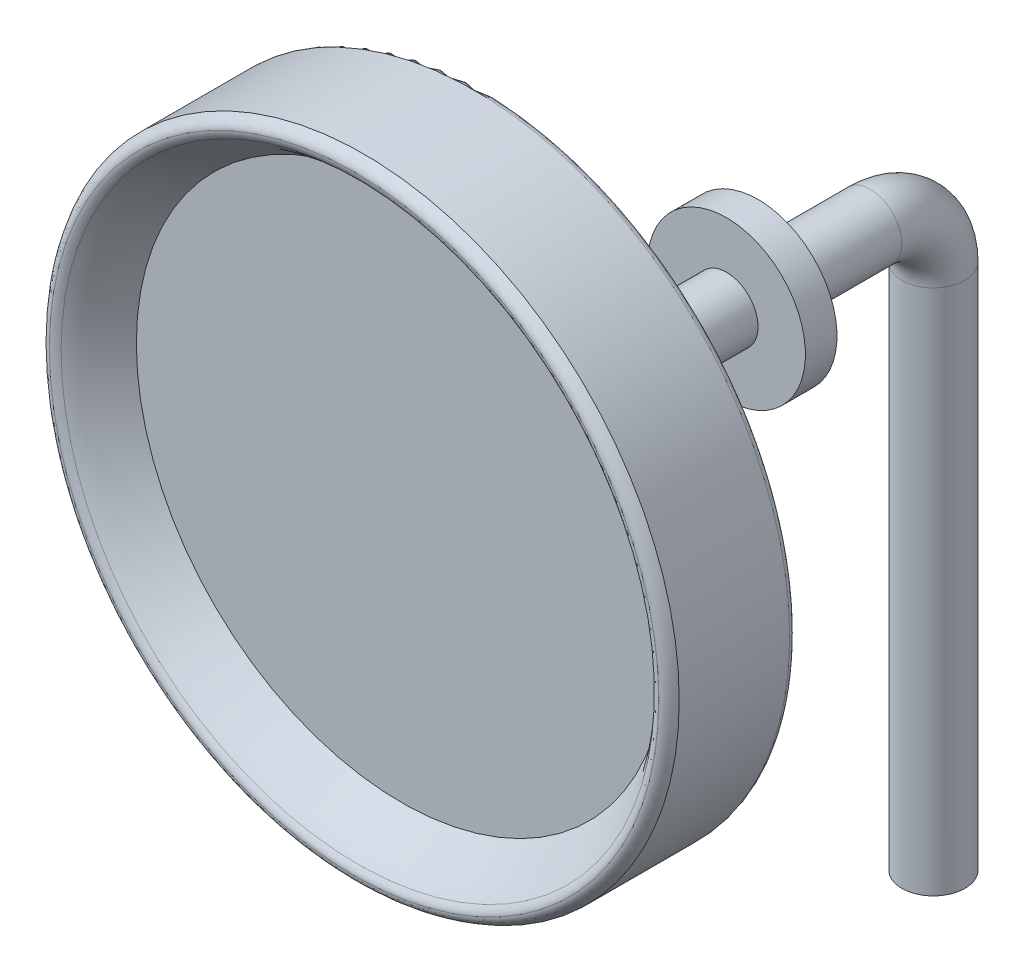
ISO-10303-21;
HEADER;
FILE_DESCRIPTION(('STEP AP214'),'2;1');
FILE_NAME('part.step','',(''),(''),'','','');
FILE_SCHEMA(('AUTOMOTIVE_DESIGN { 1 0 10303 214 1 1 1 1 }'));
ENDSEC;
DATA;
#1=APPLICATION_CONTEXT('core data for automotive mechanical design processes');
#2=APPLICATION_PROTOCOL_DEFINITION('international standard','automotive_design',2000,#1);
#3=PRODUCT_CONTEXT('',#1,'mechanical');
#4=PRODUCT('Part','Part','',(#3));
#5=PRODUCT_RELATED_PRODUCT_CATEGORY('part','',(#4));
#6=PRODUCT_DEFINITION_FORMATION('','',#4);
#7=PRODUCT_DEFINITION_CONTEXT('part definition',#1,'design');
#8=PRODUCT_DEFINITION('design','',#6,#7);
#9=PRODUCT_DEFINITION_SHAPE('','',#8);
#10=(LENGTH_UNIT() NAMED_UNIT(*) SI_UNIT(.MILLI.,.METRE.));
#11=(NAMED_UNIT(*) PLANE_ANGLE_UNIT() SI_UNIT($,.RADIAN.));
#12=(NAMED_UNIT(*) SI_UNIT($,.STERADIAN.) SOLID_ANGLE_UNIT());
#13=UNCERTAINTY_MEASURE_WITH_UNIT(LENGTH_MEASURE(1.E-05),#10,'distance_accuracy_value','');
#14=(GEOMETRIC_REPRESENTATION_CONTEXT(3) GLOBAL_UNCERTAINTY_ASSIGNED_CONTEXT((#13)) GLOBAL_UNIT_ASSIGNED_CONTEXT((#10,
#11,#12)) REPRESENTATION_CONTEXT('',''));
#15=CARTESIAN_POINT('',(0.,0.,0.));
#16=DIRECTION('',(0.,0.,1.));
#17=DIRECTION('',(1.,0.,0.));
#18=AXIS2_PLACEMENT_3D('',#15,#16,#17);
#19=CARTESIAN_POINT('',(0.,0.,-214.));
#20=DIRECTION('',(0.,0.,1.));
#21=DIRECTION('',(1.,0.,0.));
#22=AXIS2_PLACEMENT_3D('',#19,#20,#21);
#23=CYLINDRICAL_SURFACE('',#22,5.);
#24=CARTESIAN_POINT('',(0.,0.,-64.));
#25=DIRECTION('',(0.,0.,-1.));
#26=DIRECTION('',(-1.,0.,0.));
#27=AXIS2_PLACEMENT_3D('',#24,#25,#26);
#28=CIRCLE('',#27,5.);
#29=CARTESIAN_POINT('',(-5.,0.,-64.));
#30=VERTEX_POINT('',#29);
#31=EDGE_CURVE('E11',#30,#30,#28,.T.);
#32=ORIENTED_EDGE('',*,*,#31,.T.);
#33=EDGE_LOOP('',(#32));
#34=FACE_BOUND('',#33,.T.);
#35=CARTESIAN_POINT('',(0.,0.,-81.773609231206));
#36=DIRECTION('',(0.,0.,-1.));
#37=DIRECTION('',(-1.,0.,0.));
#38=AXIS2_PLACEMENT_3D('',#35,#36,#37);
#39=CIRCLE('',#38,5.);
#40=CARTESIAN_POINT('',(0.,4.99999999999999,-81.773609231206));
#41=VERTEX_POINT('',#40);
#42=EDGE_CURVE('E68',#41,#41,#39,.T.);
#43=ORIENTED_EDGE('',*,*,#42,.F.);
#44=EDGE_LOOP('',(#43));
#45=FACE_BOUND('',#44,.T.);
#46=ADVANCED_FACE('F53',(#34,#45),#23,.T.);
#47=CARTESIAN_POINT('',(0.,0.,-64.));
#48=DIRECTION('',(0.,0.,-1.));
#49=DIRECTION('',(-1.,0.,0.));
#50=AXIS2_PLACEMENT_3D('',#47,#48,#49);
#51=PLANE('',#50);
#52=ORIENTED_EDGE('',*,*,#31,.F.);
#53=EDGE_LOOP('',(#52));
#54=FACE_BOUND('',#53,.T.);
#55=ADVANCED_FACE('F77',(#54),#51,.F.);
#56=CARTESIAN_POINT('',(0.,-93.4177485507245,-91.773609231206));
#57=DIRECTION('',(0.,-1.,0.));
#58=DIRECTION('',(-1.,0.,0.));
#59=AXIS2_PLACEMENT_3D('',#56,#57,#58);
#60=PLANE('',#59);
#61=CARTESIAN_POINT('',(0.,-93.4177485507245,-91.773609231206));
#62=DIRECTION('',(0.,-1.,0.));
#63=DIRECTION('',(-1.,0.,0.));
#64=AXIS2_PLACEMENT_3D('',#61,#62,#63);
#65=CIRCLE('',#64,5.);
#66=CARTESIAN_POINT('',(-5.,-93.4177485507245,-91.773609231206));
#67=VERTEX_POINT('',#66);
#68=EDGE_CURVE('E60',#67,#67,#65,.T.);
#69=ORIENTED_EDGE('',*,*,#68,.T.);
#70=EDGE_LOOP('',(#69));
#71=FACE_BOUND('',#70,.T.);
#72=ADVANCED_FACE('F81',(#71),#60,.T.);
#73=CARTESIAN_POINT('',(0.,-10.,-81.773609231206));
#74=DIRECTION('',(-1.,0.,0.));
#75=DIRECTION('',(0.,0.,1.));
#76=AXIS2_PLACEMENT_3D('',#73,#74,#75);
#77=TOROIDAL_SURFACE('',#76,9.99999999999999,5.);
#78=CARTESIAN_POINT('',(0.,-9.99999999999999,-91.773609231206));
#79=DIRECTION('',(0.,-1.,0.));
#80=DIRECTION('',(-1.,0.,0.));
#81=AXIS2_PLACEMENT_3D('',#78,#79,#80);
#82=CIRCLE('',#81,5.);
#83=CARTESIAN_POINT('',(0.,-9.99999999999999,-96.773609231206));
#84=VERTEX_POINT('',#83);
#85=EDGE_CURVE('E64',#84,#84,#82,.T.);
#86=CARTESIAN_POINT('',(0.,-10.,-81.773609231206));
#87=DIRECTION('',(-1.,0.,0.));
#88=DIRECTION('',(0.,0.,1.));
#89=AXIS2_PLACEMENT_3D('',#86,#87,#88);
#90=CIRCLE('',#89,15.);
#91=EDGE_CURVE('',#41,#84,#90,.T.);
#92=ORIENTED_EDGE('',*,*,#42,.T.);
#93=ORIENTED_EDGE('',*,*,#85,.F.);
#94=ORIENTED_EDGE('',*,*,#91,.T.);
#95=ORIENTED_EDGE('',*,*,#91,.F.);
#96=EDGE_LOOP('',(#92,#94,#93,#95));
#97=FACE_BOUND('',#96,.T.);
#98=ADVANCED_FACE('F74',(#97),#77,.T.);
#99=CARTESIAN_POINT('',(0.,-9.99999999999999,-91.773609231206));
#100=DIRECTION('',(0.,-1.,0.));
#101=DIRECTION('',(0.,0.,-1.));
#102=AXIS2_PLACEMENT_3D('',#99,#100,#101);
#103=CYLINDRICAL_SURFACE('',#102,5.);
#104=ORIENTED_EDGE('',*,*,#68,.F.);
#105=EDGE_LOOP('',(#104));
#106=FACE_BOUND('',#105,.T.);
#107=ORIENTED_EDGE('',*,*,#85,.T.);
#108=EDGE_LOOP('',(#107));
#109=FACE_BOUND('',#108,.T.);
#110=ADVANCED_FACE('F83',(#106,#109),#103,.T.);
#111=CLOSED_SHELL('',(#46,#55,#72,#98,#110));
#112=MANIFOLD_SOLID_BREP('B2',#111);
#113=CARTESIAN_POINT('',(0.,0.,-64.));
#114=DIRECTION('',(0.,0.,1.));
#115=DIRECTION('',(1.,0.,0.));
#116=AXIS2_PLACEMENT_3D('',#113,#114,#115);
#117=CYLINDRICAL_SURFACE('',#116,12.5);
#118=CARTESIAN_POINT('',(0.,0.,-64.));
#119=DIRECTION('',(0.,0.,-1.));
#120=DIRECTION('',(-1.,0.,0.));
#121=AXIS2_PLACEMENT_3D('',#118,#119,#120);
#122=CIRCLE('',#121,12.5);
#123=CARTESIAN_POINT('',(-12.5,0.,-64.));
#124=VERTEX_POINT('',#123);
#125=EDGE_CURVE('E52',#124,#124,#122,.T.);
#126=ORIENTED_EDGE('',*,*,#125,.F.);
#127=EDGE_LOOP('',(#126));
#128=FACE_BOUND('',#127,.T.);
#129=CARTESIAN_POINT('',(0.,0.,-59.));
#130=DIRECTION('',(0.,0.,-1.));
#131=DIRECTION('',(-1.,0.,0.));
#132=AXIS2_PLACEMENT_3D('',#129,#130,#131);
#133=CIRCLE('',#132,12.5);
#134=CARTESIAN_POINT('',(-12.5,0.,-59.));
#135=VERTEX_POINT('',#134);
#136=EDGE_CURVE('E140',#135,#135,#133,.T.);
#137=ORIENTED_EDGE('',*,*,#136,.T.);
#138=EDGE_LOOP('',(#137));
#139=FACE_BOUND('',#138,.T.);
#140=ADVANCED_FACE('F137',(#128,#139),#117,.T.);
#141=CARTESIAN_POINT('',(0.,0.,-64.));
#142=DIRECTION('',(0.,0.,-1.));
#143=DIRECTION('',(-1.,0.,0.));
#144=AXIS2_PLACEMENT_3D('',#141,#142,#143);
#145=PLANE('',#144);
#146=ORIENTED_EDGE('',*,*,#125,.T.);
#147=EDGE_LOOP('',(#146));
#148=FACE_BOUND('',#147,.T.);
#149=ADVANCED_FACE('F154',(#148),#145,.T.);
#150=CARTESIAN_POINT('',(0.,0.,-59.));
#151=DIRECTION('',(0.,0.,-1.));
#152=DIRECTION('',(-1.,0.,0.));
#153=AXIS2_PLACEMENT_3D('',#150,#151,#152);
#154=PLANE('',#153);
#155=ORIENTED_EDGE('',*,*,#136,.F.);
#156=EDGE_LOOP('',(#155));
#157=FACE_BOUND('',#156,.T.);
#158=ADVANCED_FACE('F152',(#157),#154,.F.);
#159=CLOSED_SHELL('',(#140,#149,#158));
#160=MANIFOLD_SOLID_BREP('B6',#159);
#161=CARTESIAN_POINT('',(0.,0.,-59.));
#162=DIRECTION('',(0.,0.,1.));
#163=DIRECTION('',(1.,0.,0.));
#164=AXIS2_PLACEMENT_3D('',#161,#162,#163);
#165=CYLINDRICAL_SURFACE('',#164,5.);
#166=CARTESIAN_POINT('',(0.,0.,-59.));
#167=DIRECTION('',(0.,0.,-1.));
#168=DIRECTION('',(-1.,0.,0.));
#169=AXIS2_PLACEMENT_3D('',#166,#167,#168);
#170=CIRCLE('',#169,5.);
#171=CARTESIAN_POINT('',(-5.,0.,-59.));
#172=VERTEX_POINT('',#171);
#173=EDGE_CURVE('E136',#172,#172,#170,.T.);
#174=ORIENTED_EDGE('',*,*,#173,.F.);
#175=EDGE_LOOP('',(#174));
#176=FACE_BOUND('',#175,.T.);
#177=CARTESIAN_POINT('',(0.,0.,-47.));
#178=DIRECTION('',(0.,0.,-1.));
#179=DIRECTION('',(-1.,0.,0.));
#180=AXIS2_PLACEMENT_3D('',#177,#178,#179);
#181=CIRCLE('',#180,5.);
#182=CARTESIAN_POINT('',(-5.,0.,-47.));
#183=VERTEX_POINT('',#182);
#184=EDGE_CURVE('E193',#183,#183,#181,.T.);
#185=ORIENTED_EDGE('',*,*,#184,.T.);
#186=EDGE_LOOP('',(#185));
#187=FACE_BOUND('',#186,.T.);
#188=ADVANCED_FACE('F190',(#176,#187),#165,.T.);
#189=CARTESIAN_POINT('',(0.,0.,-59.));
#190=DIRECTION('',(0.,0.,-1.));
#191=DIRECTION('',(-1.,0.,0.));
#192=AXIS2_PLACEMENT_3D('',#189,#190,#191);
#193=PLANE('',#192);
#194=ORIENTED_EDGE('',*,*,#173,.T.);
#195=EDGE_LOOP('',(#194));
#196=FACE_BOUND('',#195,.T.);
#197=ADVANCED_FACE('F207',(#196),#193,.T.);
#198=CARTESIAN_POINT('',(0.,0.,-47.));
#199=DIRECTION('',(0.,0.,-1.));
#200=DIRECTION('',(-1.,0.,0.));
#201=AXIS2_PLACEMENT_3D('',#198,#199,#200);
#202=PLANE('',#201);
#203=ORIENTED_EDGE('',*,*,#184,.F.);
#204=EDGE_LOOP('',(#203));
#205=FACE_BOUND('',#204,.T.);
#206=ADVANCED_FACE('F205',(#205),#202,.F.);
#207=CLOSED_SHELL('',(#188,#197,#206));
#208=MANIFOLD_SOLID_BREP('B47',#207);
#209=CARTESIAN_POINT('',(0.,0.,-42.));
#210=DIRECTION('',(0.,0.,1.));
#211=DIRECTION('',(1.,0.,0.));
#212=AXIS2_PLACEMENT_3D('',#209,#210,#211);
#213=CYLINDRICAL_SURFACE('',#212,5.);
#214=CARTESIAN_POINT('',(0.,0.,-42.));
#215=DIRECTION('',(0.,0.,-1.));
#216=DIRECTION('',(-1.,0.,0.));
#217=AXIS2_PLACEMENT_3D('',#214,#215,#216);
#218=CIRCLE('',#217,5.);
#219=CARTESIAN_POINT('',(-5.,0.,-42.));
#220=VERTEX_POINT('',#219);
#221=EDGE_CURVE('E189',#220,#220,#218,.T.);
#222=ORIENTED_EDGE('',*,*,#221,.F.);
#223=EDGE_LOOP('',(#222));
#224=FACE_BOUND('',#223,.T.);
#225=CARTESIAN_POINT('',(0.,0.,-39.));
#226=DIRECTION('',(0.,0.,-1.));
#227=DIRECTION('',(-1.,0.,0.));
#228=AXIS2_PLACEMENT_3D('',#225,#226,#227);
#229=CIRCLE('',#228,5.);
#230=CARTESIAN_POINT('',(-5.,0.,-39.));
#231=VERTEX_POINT('',#230);
#232=EDGE_CURVE('E246',#231,#231,#229,.T.);
#233=ORIENTED_EDGE('',*,*,#232,.T.);
#234=EDGE_LOOP('',(#233));
#235=FACE_BOUND('',#234,.T.);
#236=ADVANCED_FACE('F243',(#224,#235),#213,.T.);
#237=CARTESIAN_POINT('',(0.,0.,-39.));
#238=DIRECTION('',(0.,0.,-1.));
#239=DIRECTION('',(-1.,0.,0.));
#240=AXIS2_PLACEMENT_3D('',#237,#238,#239);
#241=PLANE('',#240);
#242=ORIENTED_EDGE('',*,*,#232,.F.);
#243=EDGE_LOOP('',(#242));
#244=FACE_BOUND('',#243,.T.);
#245=ADVANCED_FACE('F270',(#244),#241,.F.);
#246=CARTESIAN_POINT('',(0.,0.,-47.));
#247=DIRECTION('',(0.,0.,1.));
#248=DIRECTION('',(1.,0.,0.));
#249=AXIS2_PLACEMENT_3D('',#246,#247,#248);
#250=CYLINDRICAL_SURFACE('',#249,7.5);
#251=CARTESIAN_POINT('',(0.,0.,-47.));
#252=DIRECTION('',(0.,0.,-1.));
#253=DIRECTION('',(-1.,0.,0.));
#254=AXIS2_PLACEMENT_3D('',#251,#252,#253);
#255=CIRCLE('',#254,7.5);
#256=CARTESIAN_POINT('',(-7.5,0.,-47.));
#257=VERTEX_POINT('',#256);
#258=EDGE_CURVE('E255',#257,#257,#255,.T.);
#259=ORIENTED_EDGE('',*,*,#258,.F.);
#260=EDGE_LOOP('',(#259));
#261=FACE_BOUND('',#260,.T.);
#262=CARTESIAN_POINT('',(0.,0.,-42.));
#263=DIRECTION('',(0.,0.,-1.));
#264=DIRECTION('',(-1.,0.,0.));
#265=AXIS2_PLACEMENT_3D('',#262,#263,#264);
#266=CIRCLE('',#265,7.5);
#267=CARTESIAN_POINT('',(-7.5,0.,-42.));
#268=VERTEX_POINT('',#267);
#269=EDGE_CURVE('E257',#268,#268,#266,.T.);
#270=ORIENTED_EDGE('',*,*,#269,.T.);
#271=EDGE_LOOP('',(#270));
#272=FACE_BOUND('',#271,.T.);
#273=ADVANCED_FACE('F267',(#261,#272),#250,.T.);
#274=CARTESIAN_POINT('',(0.,0.,-47.));
#275=DIRECTION('',(0.,0.,-1.));
#276=DIRECTION('',(-1.,0.,0.));
#277=AXIS2_PLACEMENT_3D('',#274,#275,#276);
#278=PLANE('',#277);
#279=ORIENTED_EDGE('',*,*,#258,.T.);
#280=EDGE_LOOP('',(#279));
#281=FACE_BOUND('',#280,.T.);
#282=ADVANCED_FACE('F265',(#281),#278,.T.);
#283=CARTESIAN_POINT('',(0.,0.,-42.));
#284=DIRECTION('',(0.,0.,-1.));
#285=DIRECTION('',(-1.,0.,0.));
#286=AXIS2_PLACEMENT_3D('',#283,#284,#285);
#287=PLANE('',#286);
#288=ORIENTED_EDGE('',*,*,#221,.T.);
#289=EDGE_LOOP('',(#288));
#290=FACE_BOUND('',#289,.T.);
#291=ORIENTED_EDGE('',*,*,#269,.F.);
#292=EDGE_LOOP('',(#291));
#293=FACE_BOUND('',#292,.T.);
#294=ADVANCED_FACE('F274',(#290,#293),#287,.F.);
#295=CLOSED_SHELL('',(#236,#245,#273,#282,#294));
#296=MANIFOLD_SOLID_BREP('B131',#295);
#297=CARTESIAN_POINT('',(0.,0.,-36.));
#298=DIRECTION('',(0.,0.,1.));
#299=DIRECTION('',(1.,0.,0.));
#300=AXIS2_PLACEMENT_3D('',#297,#298,#299);
#301=CYLINDRICAL_SURFACE('',#300,5.);
#302=CARTESIAN_POINT('',(0.,0.,-36.));
#303=DIRECTION('',(0.,0.,-1.));
#304=DIRECTION('',(-1.,0.,0.));
#305=AXIS2_PLACEMENT_3D('',#302,#303,#304);
#306=CIRCLE('',#305,5.);
#307=CARTESIAN_POINT('',(-5.,0.,-36.));
#308=VERTEX_POINT('',#307);
#309=EDGE_CURVE('E242',#308,#308,#306,.T.);
#310=ORIENTED_EDGE('',*,*,#309,.F.);
#311=EDGE_LOOP('',(#310));
#312=FACE_BOUND('',#311,.T.);
#313=CARTESIAN_POINT('',(0.,0.,-33.));
#314=DIRECTION('',(0.,0.,-1.));
#315=DIRECTION('',(-1.,0.,0.));
#316=AXIS2_PLACEMENT_3D('',#313,#314,#315);
#317=CIRCLE('',#316,5.);
#318=CARTESIAN_POINT('',(-5.,0.,-33.));
#319=VERTEX_POINT('',#318);
#320=EDGE_CURVE('E333',#319,#319,#317,.T.);
#321=ORIENTED_EDGE('',*,*,#320,.T.);
#322=EDGE_LOOP('',(#321));
#323=FACE_BOUND('',#322,.T.);
#324=ADVANCED_FACE('F330',(#312,#323),#301,.T.);
#325=CARTESIAN_POINT('',(0.,0.,-33.));
#326=DIRECTION('',(0.,0.,-1.));
#327=DIRECTION('',(-1.,0.,0.));
#328=AXIS2_PLACEMENT_3D('',#325,#326,#327);
#329=PLANE('',#328);
#330=ORIENTED_EDGE('',*,*,#320,.F.);
#331=EDGE_LOOP('',(#330));
#332=FACE_BOUND('',#331,.T.);
#333=ADVANCED_FACE('F357',(#332),#329,.F.);
#334=CARTESIAN_POINT('',(0.,0.,-39.));
#335=DIRECTION('',(0.,0.,1.));
#336=DIRECTION('',(1.,0.,0.));
#337=AXIS2_PLACEMENT_3D('',#334,#335,#336);
#338=CYLINDRICAL_SURFACE('',#337,7.5);
#339=CARTESIAN_POINT('',(0.,0.,-39.));
#340=DIRECTION('',(0.,0.,-1.));
#341=DIRECTION('',(-1.,0.,0.));
#342=AXIS2_PLACEMENT_3D('',#339,#340,#341);
#343=CIRCLE('',#342,7.5);
#344=CARTESIAN_POINT('',(-7.5,0.,-39.));
#345=VERTEX_POINT('',#344);
#346=EDGE_CURVE('E342',#345,#345,#343,.T.);
#347=ORIENTED_EDGE('',*,*,#346,.F.);
#348=EDGE_LOOP('',(#347));
#349=FACE_BOUND('',#348,.T.);
#350=CARTESIAN_POINT('',(0.,0.,-36.));
#351=DIRECTION('',(0.,0.,-1.));
#352=DIRECTION('',(-1.,0.,0.));
#353=AXIS2_PLACEMENT_3D('',#350,#351,#352);
#354=CIRCLE('',#353,7.5);
#355=CARTESIAN_POINT('',(-7.5,0.,-36.));
#356=VERTEX_POINT('',#355);
#357=EDGE_CURVE('E344',#356,#356,#354,.T.);
#358=ORIENTED_EDGE('',*,*,#357,.T.);
#359=EDGE_LOOP('',(#358));
#360=FACE_BOUND('',#359,.T.);
#361=ADVANCED_FACE('F354',(#349,#360),#338,.T.);
#362=CARTESIAN_POINT('',(0.,0.,-39.));
#363=DIRECTION('',(0.,0.,-1.));
#364=DIRECTION('',(-1.,0.,0.));
#365=AXIS2_PLACEMENT_3D('',#362,#363,#364);
#366=PLANE('',#365);
#367=ORIENTED_EDGE('',*,*,#346,.T.);
#368=EDGE_LOOP('',(#367));
#369=FACE_BOUND('',#368,.T.);
#370=ADVANCED_FACE('F352',(#369),#366,.T.);
#371=CARTESIAN_POINT('',(0.,0.,-36.));
#372=DIRECTION('',(0.,0.,-1.));
#373=DIRECTION('',(-1.,0.,0.));
#374=AXIS2_PLACEMENT_3D('',#371,#372,#373);
#375=PLANE('',#374);
#376=ORIENTED_EDGE('',*,*,#309,.T.);
#377=EDGE_LOOP('',(#376));
#378=FACE_BOUND('',#377,.T.);
#379=ORIENTED_EDGE('',*,*,#357,.F.);
#380=EDGE_LOOP('',(#379));
#381=FACE_BOUND('',#380,.T.);
#382=ADVANCED_FACE('F361',(#378,#381),#375,.F.);
#383=CLOSED_SHELL('',(#324,#333,#361,#370,#382));
#384=MANIFOLD_SOLID_BREP('B184',#383);
#385=CARTESIAN_POINT('',(0.,0.,-33.));
#386=DIRECTION('',(0.,0.,1.));
#387=DIRECTION('',(1.,0.,0.));
#388=AXIS2_PLACEMENT_3D('',#385,#386,#387);
#389=CYLINDRICAL_SURFACE('',#388,7.5);
#390=CARTESIAN_POINT('',(0.,0.,-33.));
#391=DIRECTION('',(0.,0.,-1.));
#392=DIRECTION('',(-1.,0.,0.));
#393=AXIS2_PLACEMENT_3D('',#390,#391,#392);
#394=CIRCLE('',#393,7.5);
#395=CARTESIAN_POINT('',(-7.5,0.,-33.));
#396=VERTEX_POINT('',#395);
#397=EDGE_CURVE('E329',#396,#396,#394,.T.);
#398=ORIENTED_EDGE('',*,*,#397,.F.);
#399=EDGE_LOOP('',(#398));
#400=FACE_BOUND('',#399,.T.);
#401=CARTESIAN_POINT('',(0.,0.,-30.));
#402=DIRECTION('',(0.,0.,-1.));
#403=DIRECTION('',(-1.,0.,0.));
#404=AXIS2_PLACEMENT_3D('',#401,#402,#403);
#405=CIRCLE('',#404,7.5);
#406=CARTESIAN_POINT('',(-7.5,0.,-30.));
#407=VERTEX_POINT('',#406);
#408=EDGE_CURVE('E420',#407,#407,#405,.T.);
#409=ORIENTED_EDGE('',*,*,#408,.T.);
#410=EDGE_LOOP('',(#409));
#411=FACE_BOUND('',#410,.T.);
#412=ADVANCED_FACE('F417',(#400,#411),#389,.T.);
#413=CARTESIAN_POINT('',(0.,0.,-33.));
#414=DIRECTION('',(0.,0.,-1.));
#415=DIRECTION('',(-1.,0.,0.));
#416=AXIS2_PLACEMENT_3D('',#413,#414,#415);
#417=PLANE('',#416);
#418=ORIENTED_EDGE('',*,*,#397,.T.);
#419=EDGE_LOOP('',(#418));
#420=FACE_BOUND('',#419,.T.);
#421=ADVANCED_FACE('F434',(#420),#417,.T.);
#422=CARTESIAN_POINT('',(0.,0.,-30.));
#423=DIRECTION('',(0.,0.,-1.));
#424=DIRECTION('',(-1.,0.,0.));
#425=AXIS2_PLACEMENT_3D('',#422,#423,#424);
#426=PLANE('',#425);
#427=ORIENTED_EDGE('',*,*,#408,.F.);
#428=EDGE_LOOP('',(#427));
#429=FACE_BOUND('',#428,.T.);
#430=ADVANCED_FACE('F432',(#429),#426,.F.);
#431=CLOSED_SHELL('',(#412,#421,#430));
#432=MANIFOLD_SOLID_BREP('B237',#431);
#433=CARTESIAN_POINT('',(0.,0.,-27.));
#434=DIRECTION('',(0.,0.,1.));
#435=DIRECTION('',(1.,0.,0.));
#436=AXIS2_PLACEMENT_3D('',#433,#434,#435);
#437=CYLINDRICAL_SURFACE('',#436,7.5);
#438=CARTESIAN_POINT('',(0.,0.,-27.));
#439=DIRECTION('',(0.,0.,-1.));
#440=DIRECTION('',(-1.,0.,0.));
#441=AXIS2_PLACEMENT_3D('',#438,#439,#440);
#442=CIRCLE('',#441,7.5);
#443=CARTESIAN_POINT('',(-7.5,0.,-27.));
#444=VERTEX_POINT('',#443);
#445=EDGE_CURVE('E416',#444,#444,#442,.T.);
#446=ORIENTED_EDGE('',*,*,#445,.F.);
#447=EDGE_LOOP('',(#446));
#448=FACE_BOUND('',#447,.T.);
#449=CARTESIAN_POINT('',(0.,0.,-22.));
#450=DIRECTION('',(0.,0.,-1.));
#451=DIRECTION('',(-1.,0.,0.));
#452=AXIS2_PLACEMENT_3D('',#449,#450,#451);
#453=CIRCLE('',#452,7.5);
#454=CARTESIAN_POINT('',(-7.5,0.,-22.));
#455=VERTEX_POINT('',#454);
#456=EDGE_CURVE('E472',#455,#455,#453,.T.);
#457=ORIENTED_EDGE('',*,*,#456,.T.);
#458=EDGE_LOOP('',(#457));
#459=FACE_BOUND('',#458,.T.);
#460=ADVANCED_FACE('F469',(#448,#459),#437,.T.);
#461=CARTESIAN_POINT('',(0.,0.,-27.));
#462=DIRECTION('',(0.,0.,-1.));
#463=DIRECTION('',(-1.,0.,0.));
#464=AXIS2_PLACEMENT_3D('',#461,#462,#463);
#465=PLANE('',#464);
#466=CARTESIAN_POINT('',(0.,0.,-27.));
#467=DIRECTION('',(0.,0.,-1.));
#468=DIRECTION('',(-1.,0.,0.));
#469=AXIS2_PLACEMENT_3D('',#466,#467,#468);
#470=CIRCLE('',#469,5.);
#471=CARTESIAN_POINT('',(-5.,0.,-27.));
#472=VERTEX_POINT('',#471);
#473=EDGE_CURVE('E483',#472,#472,#470,.T.);
#474=ORIENTED_EDGE('',*,*,#473,.F.);
#475=EDGE_LOOP('',(#474));
#476=FACE_BOUND('',#475,.T.);
#477=ORIENTED_EDGE('',*,*,#445,.T.);
#478=EDGE_LOOP('',(#477));
#479=FACE_BOUND('',#478,.T.);
#480=ADVANCED_FACE('F500',(#476,#479),#465,.T.);
#481=CARTESIAN_POINT('',(0.,0.,-22.));
#482=DIRECTION('',(0.,0.,-1.));
#483=DIRECTION('',(-1.,0.,0.));
#484=AXIS2_PLACEMENT_3D('',#481,#482,#483);
#485=PLANE('',#484);
#486=ORIENTED_EDGE('',*,*,#456,.F.);
#487=EDGE_LOOP('',(#486));
#488=FACE_BOUND('',#487,.T.);
#489=ADVANCED_FACE('F496',(#488),#485,.F.);
#490=CARTESIAN_POINT('',(0.,0.,-30.));
#491=DIRECTION('',(0.,0.,1.));
#492=DIRECTION('',(1.,0.,0.));
#493=AXIS2_PLACEMENT_3D('',#490,#491,#492);
#494=CYLINDRICAL_SURFACE('',#493,5.);
#495=CARTESIAN_POINT('',(0.,0.,-30.));
#496=DIRECTION('',(0.,0.,-1.));
#497=DIRECTION('',(-1.,0.,0.));
#498=AXIS2_PLACEMENT_3D('',#495,#496,#497);
#499=CIRCLE('',#498,5.);
#500=CARTESIAN_POINT('',(-5.,0.,-30.));
#501=VERTEX_POINT('',#500);
#502=EDGE_CURVE('E481',#501,#501,#499,.T.);
#503=ORIENTED_EDGE('',*,*,#502,.F.);
#504=EDGE_LOOP('',(#503));
#505=FACE_BOUND('',#504,.T.);
#506=ORIENTED_EDGE('',*,*,#473,.T.);
#507=EDGE_LOOP('',(#506));
#508=FACE_BOUND('',#507,.T.);
#509=ADVANCED_FACE('F493',(#505,#508),#494,.T.);
#510=CARTESIAN_POINT('',(0.,0.,-30.));
#511=DIRECTION('',(0.,0.,-1.));
#512=DIRECTION('',(-1.,0.,0.));
#513=AXIS2_PLACEMENT_3D('',#510,#511,#512);
#514=PLANE('',#513);
#515=ORIENTED_EDGE('',*,*,#502,.T.);
#516=EDGE_LOOP('',(#515));
#517=FACE_BOUND('',#516,.T.);
#518=ADVANCED_FACE('F491',(#517),#514,.T.);
#519=CLOSED_SHELL('',(#460,#480,#489,#509,#518));
#520=MANIFOLD_SOLID_BREP('B324',#519);
#521=CARTESIAN_POINT('',(0.,50.,-1.50877339468194));
#522=CARTESIAN_POINT('',(0.,48.3630326490557,1.70300187782354));
#523=CARTESIAN_POINT('',(0.,44.9523702902036,-2.97356539742622));
#524=CARTESIAN_POINT('',(0.,42.9177088099438,-6.09356868594258));
#525=CARTESIAN_POINT('',(0.,42.,-7.5));
#526=B_SPLINE_CURVE_WITH_KNOTS('',3,(#521,#522,#523,#524,#525),.UNSPECIFIED.,.F.,.F.,(4,1,4),
(0.,0.403839000632815,0.727380334104881),.UNSPECIFIED.);
#527=CARTESIAN_POINT('',(0.,0.,0.));
#528=DIRECTION('',(0.,0.,-1.));
#529=AXIS1_PLACEMENT('',#527,#528);
#530=SURFACE_OF_REVOLUTION('',#526,#529);
#531=CARTESIAN_POINT('',(0.,0.,-1.75245136734307E-10));
#532=DIRECTION('',(0.,0.,-1.));
#533=DIRECTION('',(-1.,0.,0.));
#534=AXIS2_PLACEMENT_3D('',#531,#532,#533);
#535=CIRCLE('',#534,48.2582657867458);
#536=CARTESIAN_POINT('',(-48.2582657867458,0.,-1.75245136734307E-10));
#537=VERTEX_POINT('',#536);
#538=EDGE_CURVE('E570',#537,#537,#535,.T.);
#539=ORIENTED_EDGE('',*,*,#538,.F.);
#540=EDGE_LOOP('',(#539));
#541=FACE_BOUND('',#540,.T.);
#542=CARTESIAN_POINT('',(0.,0.,-0.576319574251637));
#543=DIRECTION('',(0.,0.,-1.));
#544=DIRECTION('',(-1.,0.,0.));
#545=AXIS2_PLACEMENT_3D('',#542,#543,#544);
#546=CIRCLE('',#545,46.9999999999955);
#547=CARTESIAN_POINT('',(-46.9999999999955,0.,-0.576319574251637));
#548=VERTEX_POINT('',#547);
#549=EDGE_CURVE('E468',#548,#548,#546,.T.);
#550=ORIENTED_EDGE('',*,*,#549,.T.);
#551=EDGE_LOOP('',(#550));
#552=FACE_BOUND('',#551,.T.);
#553=ADVANCED_FACE('F548',(#541,#552),#530,.F.);
#554=CARTESIAN_POINT('',(0.,0.,0.));
#555=DIRECTION('',(0.,0.,-1.));
#556=DIRECTION('',(-1.,0.,0.));
#557=AXIS2_PLACEMENT_3D('',#554,#555,#556);
#558=CYLINDRICAL_SURFACE('',#557,50.);
#559=CARTESIAN_POINT('',(0.,0.,-19.));
#560=DIRECTION('',(0.,0.,-1.));
#561=DIRECTION('',(-1.,0.,0.));
#562=AXIS2_PLACEMENT_3D('',#559,#560,#561);
#563=CIRCLE('',#562,50.);
#564=CARTESIAN_POINT('',(-50.,0.,-19.));
#565=VERTEX_POINT('',#564);
#566=EDGE_CURVE('E583',#565,#565,#563,.T.);
#567=ORIENTED_EDGE('',*,*,#566,.F.);
#568=EDGE_LOOP('',(#567));
#569=FACE_BOUND('',#568,.T.);
#570=CARTESIAN_POINT('',(0.,0.,-1.50877339468194));
#571=DIRECTION('',(0.,0.,-1.));
#572=DIRECTION('',(-1.,0.,0.));
#573=AXIS2_PLACEMENT_3D('',#570,#571,#572);
#574=CIRCLE('',#573,50.);
#575=CARTESIAN_POINT('',(-50.,0.,-1.50877339468194));
#576=VERTEX_POINT('',#575);
#577=EDGE_CURVE('E556',#576,#576,#574,.T.);
#578=ORIENTED_EDGE('',*,*,#577,.T.);
#579=EDGE_LOOP('',(#578));
#580=FACE_BOUND('',#579,.T.);
#581=ADVANCED_FACE('F550',(#569,#580),#558,.T.);
#582=CARTESIAN_POINT('',(0.,0.,-1.75245136734307E-10));
#583=DIRECTION('',(0.,0.,-1.));
#584=DIRECTION('',(-1.,0.,0.));
#585=AXIS2_PLACEMENT_3D('',#582,#583,#584);
#586=CIRCLE('',#585,48.2932275332139);
#587=CARTESIAN_POINT('',(-48.2932275332139,0.,-1.75245136734307E-10));
#588=VERTEX_POINT('',#587);
#589=EDGE_CURVE('E564',#588,#588,#586,.T.);
#590=ORIENTED_EDGE('',*,*,#589,.T.);
#591=EDGE_LOOP('',(#590));
#592=FACE_BOUND('',#591,.T.);
#593=ORIENTED_EDGE('',*,*,#577,.F.);
#594=EDGE_LOOP('',(#593));
#595=FACE_BOUND('',#594,.T.);
#596=ADVANCED_FACE('F603',(#592,#595),#530,.F.);
#597=CARTESIAN_POINT('',(0.,0.,-1.75245136734307E-10));
#598=DIRECTION('',(0.,0.,-1.));
#599=DIRECTION('',(-1.,0.,0.));
#600=AXIS2_PLACEMENT_3D('',#597,#598,#599);
#601=PLANE('',#600);
#602=ORIENTED_EDGE('',*,*,#589,.F.);
#603=EDGE_LOOP('',(#602));
#604=FACE_BOUND('',#603,.T.);
#605=ORIENTED_EDGE('',*,*,#538,.T.);
#606=EDGE_LOOP('',(#605));
#607=FACE_BOUND('',#606,.T.);
#608=ADVANCED_FACE('F601',(#604,#607),#601,.F.);
#609=ORIENTED_EDGE('',*,*,#549,.F.);
#610=EDGE_LOOP('',(#609));
#611=FACE_BOUND('',#610,.T.);
#612=CARTESIAN_POINT('',(0.,0.,-7.5));
#613=DIRECTION('',(0.,0.,-1.));
#614=DIRECTION('',(-1.,0.,0.));
#615=AXIS2_PLACEMENT_3D('',#612,#613,#614);
#616=CIRCLE('',#615,42.);
#617=CARTESIAN_POINT('',(-42.,0.,-7.5));
#618=VERTEX_POINT('',#617);
#619=EDGE_CURVE('E576',#618,#618,#616,.T.);
#620=ORIENTED_EDGE('',*,*,#619,.T.);
#621=EDGE_LOOP('',(#620));
#622=FACE_BOUND('',#621,.T.);
#623=ADVANCED_FACE('F597',(#611,#622),#530,.F.);
#624=CARTESIAN_POINT('',(0.,0.,-7.5));
#625=DIRECTION('',(0.,0.,-1.));
#626=DIRECTION('',(-1.,0.,0.));
#627=AXIS2_PLACEMENT_3D('',#624,#625,#626);
#628=PLANE('',#627);
#629=ORIENTED_EDGE('',*,*,#619,.F.);
#630=EDGE_LOOP('',(#629));
#631=FACE_BOUND('',#630,.T.);
#632=ADVANCED_FACE('F600',(#631),#628,.F.);
#633=CARTESIAN_POINT('',(0.,0.,-20.));
#634=DIRECTION('',(0.,0.,-1.));
#635=DIRECTION('',(-1.,0.,0.));
#636=AXIS2_PLACEMENT_3D('',#633,#634,#635);
#637=PLANE('',#636);
#638=CARTESIAN_POINT('',(0.,0.,-20.));
#639=DIRECTION('',(0.,0.,-1.));
#640=DIRECTION('',(-1.,0.,0.));
#641=AXIS2_PLACEMENT_3D('',#638,#639,#640);
#642=CIRCLE('',#641,17.5);
#643=CARTESIAN_POINT('',(-17.5,0.,-20.));
#644=VERTEX_POINT('',#643);
#645=EDGE_CURVE('E591',#644,#644,#642,.T.);
#646=ORIENTED_EDGE('',*,*,#645,.F.);
#647=EDGE_LOOP('',(#646));
#648=FACE_BOUND('',#647,.T.);
#649=CARTESIAN_POINT('',(0.,0.,-20.));
#650=DIRECTION('',(0.,0.,-1.));
#651=DIRECTION('',(-1.,0.,0.));
#652=AXIS2_PLACEMENT_3D('',#649,#650,#651);
#653=CIRCLE('',#652,49.);
#654=CARTESIAN_POINT('',(-49.,0.,-20.));
#655=VERTEX_POINT('',#654);
#656=EDGE_CURVE('E580',#655,#655,#653,.T.);
#657=ORIENTED_EDGE('',*,*,#656,.T.);
#658=EDGE_LOOP('',(#657));
#659=FACE_BOUND('',#658,.T.);
#660=ADVANCED_FACE('F627',(#648,#659),#637,.T.);
#661=CARTESIAN_POINT('',(0.,0.,-19.));
#662=DIRECTION('',(0.,0.,-1.));
#663=DIRECTION('',(-1.,0.,0.));
#664=AXIS2_PLACEMENT_3D('',#661,#662,#663);
#665=TOROIDAL_SURFACE('',#664,49.,1.);
#666=ORIENTED_EDGE('',*,*,#656,.F.);
#667=EDGE_LOOP('',(#666));
#668=FACE_BOUND('',#667,.T.);
#669=ORIENTED_EDGE('',*,*,#566,.T.);
#670=EDGE_LOOP('',(#669));
#671=FACE_BOUND('',#670,.T.);
#672=ADVANCED_FACE('F624',(#668,#671),#665,.T.);
#673=CARTESIAN_POINT('',(0.,0.,-22.));
#674=DIRECTION('',(0.,0.,1.));
#675=DIRECTION('',(1.,0.,0.));
#676=AXIS2_PLACEMENT_3D('',#673,#674,#675);
#677=CYLINDRICAL_SURFACE('',#676,17.5);
#678=CARTESIAN_POINT('',(0.,0.,-22.));
#679=DIRECTION('',(0.,0.,-1.));
#680=DIRECTION('',(-1.,0.,0.));
#681=AXIS2_PLACEMENT_3D('',#678,#679,#680);
#682=CIRCLE('',#681,17.5);
#683=CARTESIAN_POINT('',(-17.5,0.,-22.));
#684=VERTEX_POINT('',#683);
#685=EDGE_CURVE('E586',#684,#684,#682,.T.);
#686=ORIENTED_EDGE('',*,*,#685,.F.);
#687=EDGE_LOOP('',(#686));
#688=FACE_BOUND('',#687,.T.);
#689=ORIENTED_EDGE('',*,*,#645,.T.);
#690=EDGE_LOOP('',(#689));
#691=FACE_BOUND('',#690,.T.);
#692=ADVANCED_FACE('F626',(#688,#691),#677,.T.);
#693=CARTESIAN_POINT('',(0.,0.,-22.));
#694=DIRECTION('',(0.,0.,-1.));
#695=DIRECTION('',(-1.,0.,0.));
#696=AXIS2_PLACEMENT_3D('',#693,#694,#695);
#697=PLANE('',#696);
#698=ORIENTED_EDGE('',*,*,#685,.T.);
#699=EDGE_LOOP('',(#698));
#700=FACE_BOUND('',#699,.T.);
#701=ADVANCED_FACE('F634',(#700),#697,.T.);
#702=CLOSED_SHELL('',(#553,#581,#596,#608,#623,#632,#660,#672,#692,#701));
#703=MANIFOLD_SOLID_BREP('B411',#702);
#704=ADVANCED_BREP_SHAPE_REPRESENTATION('',(#18,#112,#160,#208,#296,#384,#432,#520,#703),#14);
#705=SHAPE_DEFINITION_REPRESENTATION(#9,#704);
ENDSEC;
END-ISO-10303-21;
